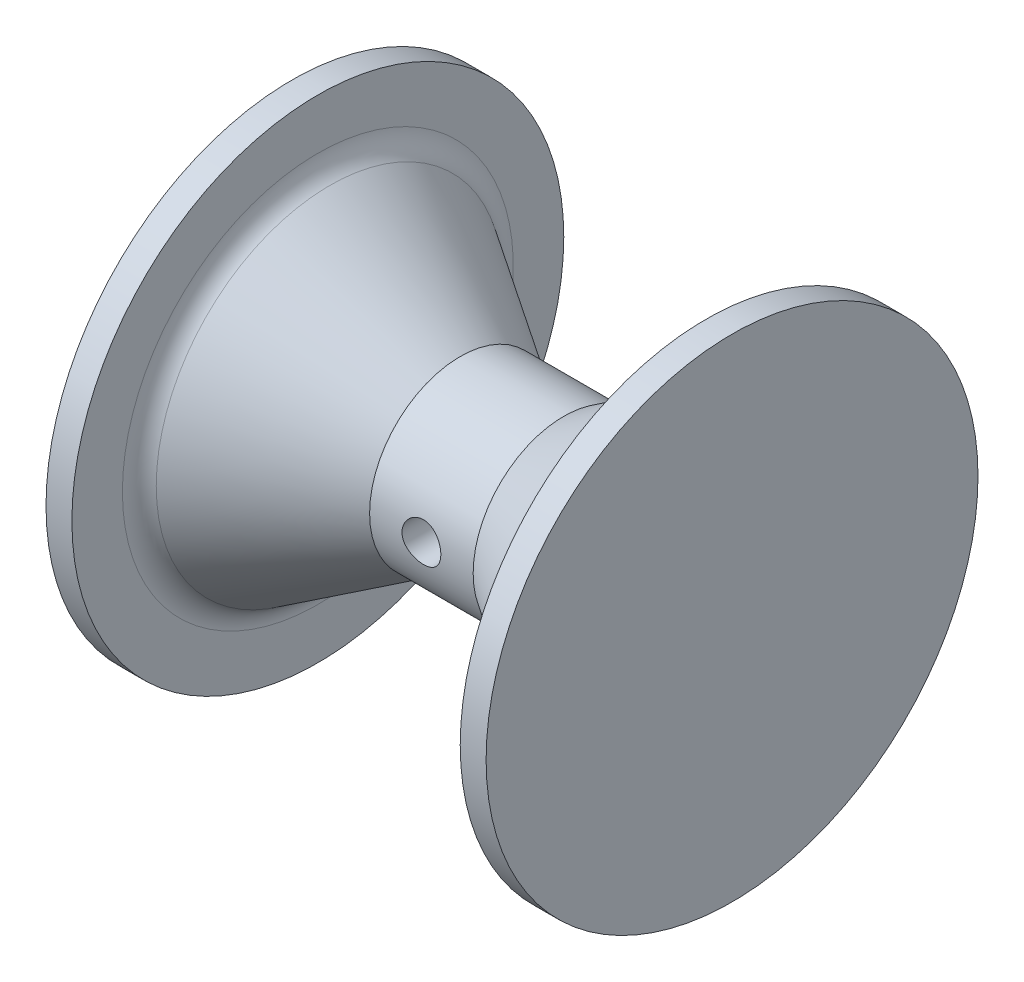
ISO-10303-21;
HEADER;
FILE_DESCRIPTION(('STEP AP214'),'2;1');
FILE_NAME('part.step','',(''),(''),'','','');
FILE_SCHEMA(('AUTOMOTIVE_DESIGN { 1 0 10303 214 1 1 1 1 }'));
ENDSEC;
DATA;
#1=APPLICATION_CONTEXT('core data for automotive mechanical design processes');
#2=APPLICATION_PROTOCOL_DEFINITION('international standard','automotive_design',2000,#1);
#3=PRODUCT_CONTEXT('',#1,'mechanical');
#4=PRODUCT('Part','Part','',(#3));
#5=PRODUCT_RELATED_PRODUCT_CATEGORY('part','',(#4));
#6=PRODUCT_DEFINITION_FORMATION('','',#4);
#7=PRODUCT_DEFINITION_CONTEXT('part definition',#1,'design');
#8=PRODUCT_DEFINITION('design','',#6,#7);
#9=PRODUCT_DEFINITION_SHAPE('','',#8);
#10=(LENGTH_UNIT() NAMED_UNIT(*) SI_UNIT(.MILLI.,.METRE.));
#11=(NAMED_UNIT(*) PLANE_ANGLE_UNIT() SI_UNIT($,.RADIAN.));
#12=(NAMED_UNIT(*) SI_UNIT($,.STERADIAN.) SOLID_ANGLE_UNIT());
#13=UNCERTAINTY_MEASURE_WITH_UNIT(LENGTH_MEASURE(1.E-05),#10,'distance_accuracy_value','');
#14=(GEOMETRIC_REPRESENTATION_CONTEXT(3) GLOBAL_UNCERTAINTY_ASSIGNED_CONTEXT((#13)) GLOBAL_UNIT_ASSIGNED_CONTEXT((#10,
#11,#12)) REPRESENTATION_CONTEXT('',''));
#15=CARTESIAN_POINT('',(0.,0.,0.));
#16=DIRECTION('',(0.,0.,1.));
#17=DIRECTION('',(1.,0.,0.));
#18=AXIS2_PLACEMENT_3D('',#15,#16,#17);
#19=CARTESIAN_POINT('',(-4.,0.,0.));
#20=DIRECTION('',(-1.,0.,0.));
#21=DIRECTION('',(0.,0.,1.));
#22=AXIS2_PLACEMENT_3D('',#19,#20,#21);
#23=CONICAL_SURFACE('',#22,7.,0.566729217523506);
#24=CARTESIAN_POINT('',(-14.0737509843863,0.,0.));
#25=DIRECTION('',(-1.,0.,0.));
#26=DIRECTION('',(0.,0.,1.));
#27=AXIS2_PLACEMENT_3D('',#24,#25,#26);
#28=CIRCLE('',#27,13.4105688082458);
#29=CARTESIAN_POINT('',(-14.0737509843863,0.,13.4105688082458));
#30=VERTEX_POINT('',#29);
#31=EDGE_CURVE('E194',#30,#30,#28,.F.);
#32=ORIENTED_EDGE('',*,*,#31,.T.);
#33=EDGE_LOOP('',(#32));
#34=FACE_BOUND('',#33,.T.);
#35=CARTESIAN_POINT('',(-4.,0.,0.));
#36=DIRECTION('',(-1.,0.,0.));
#37=DIRECTION('',(0.,0.,1.));
#38=AXIS2_PLACEMENT_3D('',#35,#36,#37);
#39=CIRCLE('',#38,7.);
#40=CARTESIAN_POINT('',(-4.,0.,7.));
#41=VERTEX_POINT('',#40);
#42=EDGE_CURVE('E115',#41,#41,#39,.T.);
#43=ORIENTED_EDGE('',*,*,#42,.T.);
#44=EDGE_LOOP('',(#43));
#45=FACE_BOUND('',#44,.T.);
#46=ADVANCED_FACE('F39',(#34,#45),#23,.T.);
#47=CARTESIAN_POINT('',(0.,0.,0.));
#48=DIRECTION('',(-1.,0.,0.));
#49=DIRECTION('',(0.,0.,1.));
#50=AXIS2_PLACEMENT_3D('',#47,#48,#49);
#51=CYLINDRICAL_SURFACE('',#50,7.);
#52=CARTESIAN_POINT('',(1.5,0.,7.));
#53=CARTESIAN_POINT('',(1.4999971004257,-0.0832358860906166,6.99999846043226));
#54=CARTESIAN_POINT('',(1.49304839161214,-0.166507195600275,6.9985002594971));
#55=CARTESIAN_POINT('',(1.46546434314641,-0.330687344293327,6.99266829827728));
#56=CARTESIAN_POINT('',(1.44481895580507,-0.41159440357119,6.98833245637099));
#57=CARTESIAN_POINT('',(1.39051563539196,-0.568649323817736,6.97730831788826));
#58=CARTESIAN_POINT('',(1.35687102061868,-0.644801963446555,6.97062242967171));
#59=CARTESIAN_POINT('',(1.27756591382874,-0.790378177960787,6.9556210681797));
#60=CARTESIAN_POINT('',(1.23190583075006,-0.859801981747369,6.94730565036661));
#61=CARTESIAN_POINT('',(1.12911970032649,-0.991024790535229,6.92981369246311));
#62=CARTESIAN_POINT('',(1.07184377810147,-1.05270503419445,6.92062683143259));
#63=CARTESIAN_POINT('',(0.947773684314803,-1.16566042389435,6.90250069814144));
#64=CARTESIAN_POINT('',(0.880978691748742,-1.21693467150908,6.8935614473163));
#65=CARTESIAN_POINT('',(0.738894247139567,-1.30814204379809,6.87684116047225));
#66=CARTESIAN_POINT('',(0.66352248224379,-1.34794958335009,6.8690733634436));
#67=CARTESIAN_POINT('',(0.506965546233162,-1.41428823691148,6.85572325558537));
#68=CARTESIAN_POINT('',(0.425781041507426,-1.44082087001716,6.85014069470711));
#69=CARTESIAN_POINT('',(0.261188913411926,-1.47946574422454,6.84189808926311));
#70=CARTESIAN_POINT('',(0.177832724336135,-1.49178779748342,6.83919556896486));
#71=CARTESIAN_POINT('',(0.0101957674930052,-1.50231395206577,6.83689139845106));
#72=CARTESIAN_POINT('',(-0.0740848901799469,-1.50051971664629,6.83728938291729));
#73=CARTESIAN_POINT('',(-0.239624687933792,-1.48303326340861,6.84110276603832));
#74=CARTESIAN_POINT('',(-0.320910889100153,-1.46758398649408,6.84446541682162));
#75=CARTESIAN_POINT('',(-0.479710240289342,-1.42361054298677,6.85374593375788));
#76=CARTESIAN_POINT('',(-0.557223186032321,-1.39508566936466,6.85966393808402));
#77=CARTESIAN_POINT('',(-0.706962872873339,-1.32554551075991,6.87344080755724));
#78=CARTESIAN_POINT('',(-0.779144512712551,-1.2844361097283,6.88131420983365));
#79=CARTESIAN_POINT('',(-0.915675164957957,-1.19096007283993,6.89810572501288));
#80=CARTESIAN_POINT('',(-0.980023148686202,-1.13859196103562,6.90702397481896));
#81=CARTESIAN_POINT('',(-1.1004593556734,-1.0227954275532,6.92512718393878));
#82=CARTESIAN_POINT('',(-1.15634870658474,-0.95916023396441,6.93431383972178));
#83=CARTESIAN_POINT('',(-1.25669373368966,-0.823317306269096,6.95175017497059));
#84=CARTESIAN_POINT('',(-1.30114921860039,-0.7511094287754,6.95999983875972));
#85=CARTESIAN_POINT('',(-1.37741067990693,-0.59993346204996,6.97465778534003));
#86=CARTESIAN_POINT('',(-1.40919141257798,-0.520952258863483,6.98106238643354));
#87=CARTESIAN_POINT('',(-1.45897564832109,-0.358603146685707,6.99128109245334));
#88=CARTESIAN_POINT('',(-1.47698107256332,-0.275235851133669,6.99509555860384));
#89=CARTESIAN_POINT('',(-1.49841621414342,-0.108187670836629,6.99965306347808));
#90=CARTESIAN_POINT('',(-1.50211771288178,-0.0245431772716144,7.00045336521066));
#91=CARTESIAN_POINT('',(-1.49557542887484,0.142168973650405,6.99905248935969));
#92=CARTESIAN_POINT('',(-1.48533255203706,0.225236668127255,6.99685150675698));
#93=CARTESIAN_POINT('',(-1.4514177563383,0.387542537982806,6.98973143045266));
#94=CARTESIAN_POINT('',(-1.42788763052747,0.466811712908478,6.9848410504546));
#95=CARTESIAN_POINT('',(-1.36822305700518,0.620278450473418,6.9728892442151));
#96=CARTESIAN_POINT('',(-1.33208756568835,0.69447559258774,6.96582763822237));
#97=CARTESIAN_POINT('',(-1.24766645693967,0.836821397964754,6.950175043904));
#98=CARTESIAN_POINT('',(-1.19922020509027,0.90487257511114,6.94156431354275));
#99=CARTESIAN_POINT('',(-1.09176517511126,1.0319769255236,6.92381033034847));
#100=CARTESIAN_POINT('',(-1.03275508411256,1.091028978692,6.91466701142097));
#101=CARTESIAN_POINT('',(-0.904602629812864,1.19952711057989,6.89668172706324));
#102=CARTESIAN_POINT('',(-0.835299900777897,1.24878537255157,6.88784792221285));
#103=CARTESIAN_POINT('',(-0.689245403522007,1.3349641538604,6.87166654559681));
#104=CARTESIAN_POINT('',(-0.612493953022508,1.37188519913706,6.86431891048055));
#105=CARTESIAN_POINT('',(-0.454127701005397,1.43209741248548,6.8520100980739));
#106=CARTESIAN_POINT('',(-0.372542643569332,1.45546398641275,6.84703574582967));
#107=CARTESIAN_POINT('',(-0.206484416166364,1.48812696085335,6.84001186708418));
#108=CARTESIAN_POINT('',(-0.12201168879868,1.49742550780258,6.83796189439706));
#109=CARTESIAN_POINT('',(0.045532343175243,1.5015999992604,6.83704618848155));
#110=CARTESIAN_POINT('',(0.128596014980579,1.49677347258311,6.83811476518543));
#111=CARTESIAN_POINT('',(0.292697242132587,1.47349789406331,6.8431676318483));
#112=CARTESIAN_POINT('',(0.373734819386573,1.45504898957979,6.84715189026714));
#113=CARTESIAN_POINT('',(0.531258657869168,1.40519345940434,6.85755581104157));
#114=CARTESIAN_POINT('',(0.607758648664291,1.37382847170887,6.86396764224703));
#115=CARTESIAN_POINT('',(0.754455372506849,1.29906751595601,6.87850764590649));
#116=CARTESIAN_POINT('',(0.824651478615044,1.255670353015,6.88663598880363));
#117=CARTESIAN_POINT('',(0.958218193725366,1.15708290349304,6.90389055593232));
#118=CARTESIAN_POINT('',(1.02142969594698,1.10167987421237,6.91303309938926));
#119=CARTESIAN_POINT('',(1.13775626252046,0.98108655461962,6.93117449799694));
#120=CARTESIAN_POINT('',(1.1908689943122,0.915894009385597,6.94017331951296));
#121=CARTESIAN_POINT('',(1.28611595950556,0.776603147268717,6.95714491048987));
#122=CARTESIAN_POINT('',(1.32810660623098,0.702404846009642,6.96510364570626));
#123=CARTESIAN_POINT('',(1.39895452890618,0.547850160940598,6.97895826104019));
#124=CARTESIAN_POINT('',(1.42782302258504,0.46749910586388,6.98485590212343));
#125=CARTESIAN_POINT('',(1.46635218513115,0.322535217553203,6.99284848461772));
#126=CARTESIAN_POINT('',(1.47894643398003,0.258717205545978,6.99551391888263));
#127=CARTESIAN_POINT('',(1.49577130171167,0.129939960853846,6.99909024154719));
#128=CARTESIAN_POINT('',(1.50000226364606,0.0649807750887447,7.00000120191314));
#129=CARTESIAN_POINT('',(1.5,0.,7.));
#130=B_SPLINE_CURVE_WITH_KNOTS('',3,(#52,#53,#54,#55,#56,#57,#58,#59,#60,#61,#62,#63,#64,#65,
#66,#67,#68,#69,#70,#71,#72,#73,#74,#75,#76,#77,#78,#79,#80,#81,#82,#83,#84,#85,#86,#87,#88,#89,
#90,#91,#92,#93,#94,#95,#96,#97,#98,#99,#100,#101,#102,#103,#104,#105,#106,#107,#108,#109,#110,
#111,#112,#113,#114,#115,#116,#117,#118,#119,#120,#121,#122,#123,#124,#125,#126,#127,#128,#129),
.UNSPECIFIED.,.T.,.F.,(4,2,2,2,2,2,2,2,2,2,2,2,2,2,2,2,2,2,2,2,2,2,2,2,2,2,2,2,2,2,2,2,2,2,2,2,
2,2,4),(0.,0.249469836512082,0.499122883219936,0.748520824425602,0.997910278645886,
1.25074961881732,1.50361077918506,1.7591442921451,2.0146485567749,2.26633008124666,
2.51798195169165,2.76524475452928,3.01252092904568,3.26169356165968,3.51089887920889,
3.76527011050291,4.0196455970235,4.27452521139806,4.52936927256343,4.77934665704185,
5.02930780231429,5.27665060589267,5.52401389198434,5.77478733867803,6.02559197304485,
6.28082063283534,6.53603841075806,6.78982240408475,7.04356767229185,7.29200680540294,
7.5404432510827,7.78808499706785,8.03575134451623,8.28822950154114,8.54076590397115,
8.79641910357222,9.05185334010271,9.24661799132294,9.44137465337336),.UNSPECIFIED.);
#131=CARTESIAN_POINT('',(1.5,0.,7.));
#132=VERTEX_POINT('',#131);
#133=EDGE_CURVE('E84',#132,#132,#130,.T.);
#134=ORIENTED_EDGE('',*,*,#133,.T.);
#135=EDGE_LOOP('',(#134));
#136=FACE_BOUND('',#135,.T.);
#137=CARTESIAN_POINT('',(1.5,0.,-7.));
#138=CARTESIAN_POINT('',(1.4999971004257,0.0832358860906166,-6.99999846043226));
#139=CARTESIAN_POINT('',(1.49304839161214,0.166507195600275,-6.9985002594971));
#140=CARTESIAN_POINT('',(1.46546434314641,0.330687344293327,-6.99266829827728));
#141=CARTESIAN_POINT('',(1.44481895580507,0.41159440357119,-6.98833245637099));
#142=CARTESIAN_POINT('',(1.39051563539196,0.568649323817736,-6.97730831788826));
#143=CARTESIAN_POINT('',(1.35687102061868,0.644801963446555,-6.97062242967171));
#144=CARTESIAN_POINT('',(1.27756591382874,0.790378177960787,-6.9556210681797));
#145=CARTESIAN_POINT('',(1.23190583075006,0.859801981747369,-6.94730565036661));
#146=CARTESIAN_POINT('',(1.12911970032649,0.991024790535229,-6.92981369246311));
#147=CARTESIAN_POINT('',(1.07184377810147,1.05270503419445,-6.92062683143259));
#148=CARTESIAN_POINT('',(0.947773684314803,1.16566042389435,-6.90250069814144));
#149=CARTESIAN_POINT('',(0.880978691748742,1.21693467150908,-6.8935614473163));
#150=CARTESIAN_POINT('',(0.738894247139567,1.30814204379809,-6.87684116047225));
#151=CARTESIAN_POINT('',(0.66352248224379,1.34794958335009,-6.8690733634436));
#152=CARTESIAN_POINT('',(0.506965546233162,1.41428823691148,-6.85572325558537));
#153=CARTESIAN_POINT('',(0.425781041507426,1.44082087001716,-6.85014069470711));
#154=CARTESIAN_POINT('',(0.261188913411926,1.47946574422454,-6.84189808926311));
#155=CARTESIAN_POINT('',(0.177832724336135,1.49178779748342,-6.83919556896486));
#156=CARTESIAN_POINT('',(0.0101957674930052,1.50231395206577,-6.83689139845106));
#157=CARTESIAN_POINT('',(-0.0740848901799469,1.50051971664629,-6.83728938291729));
#158=CARTESIAN_POINT('',(-0.239624687933792,1.48303326340861,-6.84110276603832));
#159=CARTESIAN_POINT('',(-0.320910889100153,1.46758398649408,-6.84446541682162));
#160=CARTESIAN_POINT('',(-0.479710240289342,1.42361054298677,-6.85374593375788));
#161=CARTESIAN_POINT('',(-0.557223186032321,1.39508566936466,-6.85966393808402));
#162=CARTESIAN_POINT('',(-0.706962872873339,1.32554551075991,-6.87344080755724));
#163=CARTESIAN_POINT('',(-0.779144512712551,1.2844361097283,-6.88131420983365));
#164=CARTESIAN_POINT('',(-0.915675164957957,1.19096007283993,-6.89810572501288));
#165=CARTESIAN_POINT('',(-0.980023148686202,1.13859196103562,-6.90702397481896));
#166=CARTESIAN_POINT('',(-1.1004593556734,1.0227954275532,-6.92512718393878));
#167=CARTESIAN_POINT('',(-1.15634870658474,0.95916023396441,-6.93431383972178));
#168=CARTESIAN_POINT('',(-1.25669373368966,0.823317306269096,-6.95175017497059));
#169=CARTESIAN_POINT('',(-1.30114921860039,0.7511094287754,-6.95999983875972));
#170=CARTESIAN_POINT('',(-1.37741067990693,0.59993346204996,-6.97465778534003));
#171=CARTESIAN_POINT('',(-1.40919141257798,0.520952258863483,-6.98106238643354));
#172=CARTESIAN_POINT('',(-1.45897564832109,0.358603146685707,-6.99128109245334));
#173=CARTESIAN_POINT('',(-1.47698107256332,0.275235851133669,-6.99509555860384));
#174=CARTESIAN_POINT('',(-1.49841621414342,0.108187670836629,-6.99965306347808));
#175=CARTESIAN_POINT('',(-1.50211771288178,0.0245431772716144,-7.00045336521066));
#176=CARTESIAN_POINT('',(-1.49557542887484,-0.142168973650405,-6.99905248935969));
#177=CARTESIAN_POINT('',(-1.48533255203706,-0.225236668127255,-6.99685150675698));
#178=CARTESIAN_POINT('',(-1.4514177563383,-0.387542537982806,-6.98973143045266));
#179=CARTESIAN_POINT('',(-1.42788763052747,-0.466811712908478,-6.9848410504546));
#180=CARTESIAN_POINT('',(-1.36822305700518,-0.620278450473418,-6.9728892442151));
#181=CARTESIAN_POINT('',(-1.33208756568835,-0.69447559258774,-6.96582763822237));
#182=CARTESIAN_POINT('',(-1.24766645693967,-0.836821397964754,-6.950175043904));
#183=CARTESIAN_POINT('',(-1.19922020509027,-0.90487257511114,-6.94156431354275));
#184=CARTESIAN_POINT('',(-1.09176517511126,-1.0319769255236,-6.92381033034847));
#185=CARTESIAN_POINT('',(-1.03275508411256,-1.091028978692,-6.91466701142097));
#186=CARTESIAN_POINT('',(-0.904602629812864,-1.19952711057989,-6.89668172706324));
#187=CARTESIAN_POINT('',(-0.835299900777897,-1.24878537255157,-6.88784792221285));
#188=CARTESIAN_POINT('',(-0.689245403522007,-1.3349641538604,-6.87166654559681));
#189=CARTESIAN_POINT('',(-0.612493953022508,-1.37188519913706,-6.86431891048055));
#190=CARTESIAN_POINT('',(-0.454127701005397,-1.43209741248548,-6.8520100980739));
#191=CARTESIAN_POINT('',(-0.372542643569332,-1.45546398641275,-6.84703574582967));
#192=CARTESIAN_POINT('',(-0.206484416166364,-1.48812696085335,-6.84001186708418));
#193=CARTESIAN_POINT('',(-0.12201168879868,-1.49742550780258,-6.83796189439706));
#194=CARTESIAN_POINT('',(0.045532343175243,-1.5015999992604,-6.83704618848155));
#195=CARTESIAN_POINT('',(0.128596014980579,-1.49677347258311,-6.83811476518543));
#196=CARTESIAN_POINT('',(0.292697242132587,-1.47349789406331,-6.8431676318483));
#197=CARTESIAN_POINT('',(0.373734819386573,-1.45504898957979,-6.84715189026714));
#198=CARTESIAN_POINT('',(0.531258657869168,-1.40519345940434,-6.85755581104157));
#199=CARTESIAN_POINT('',(0.607758648664291,-1.37382847170887,-6.86396764224703));
#200=CARTESIAN_POINT('',(0.754455372506849,-1.29906751595601,-6.87850764590649));
#201=CARTESIAN_POINT('',(0.824651478615044,-1.255670353015,-6.88663598880363));
#202=CARTESIAN_POINT('',(0.958218193725366,-1.15708290349304,-6.90389055593232));
#203=CARTESIAN_POINT('',(1.02142969594698,-1.10167987421237,-6.91303309938926));
#204=CARTESIAN_POINT('',(1.13775626252046,-0.98108655461962,-6.93117449799694));
#205=CARTESIAN_POINT('',(1.1908689943122,-0.915894009385597,-6.94017331951296));
#206=CARTESIAN_POINT('',(1.28611595950556,-0.776603147268717,-6.95714491048987));
#207=CARTESIAN_POINT('',(1.32810660623098,-0.702404846009642,-6.96510364570626));
#208=CARTESIAN_POINT('',(1.39895452890618,-0.547850160940598,-6.97895826104019));
#209=CARTESIAN_POINT('',(1.42782302258504,-0.46749910586388,-6.98485590212343));
#210=CARTESIAN_POINT('',(1.46635218513115,-0.322535217553203,-6.99284848461772));
#211=CARTESIAN_POINT('',(1.47894643398003,-0.258717205545978,-6.99551391888263));
#212=CARTESIAN_POINT('',(1.49577130171167,-0.129939960853846,-6.99909024154719));
#213=CARTESIAN_POINT('',(1.50000226364606,-0.0649807750887447,-7.00000120191314));
#214=CARTESIAN_POINT('',(1.5,0.,-7.));
#215=B_SPLINE_CURVE_WITH_KNOTS('',3,(#137,#138,#139,#140,#141,#142,#143,#144,#145,#146,#147,
#148,#149,#150,#151,#152,#153,#154,#155,#156,#157,#158,#159,#160,#161,#162,#163,#164,#165,#166,
#167,#168,#169,#170,#171,#172,#173,#174,#175,#176,#177,#178,#179,#180,#181,#182,#183,#184,#185,
#186,#187,#188,#189,#190,#191,#192,#193,#194,#195,#196,#197,#198,#199,#200,#201,#202,#203,#204,
#205,#206,#207,#208,#209,#210,#211,#212,#213,#214),.UNSPECIFIED.,.T.,.F.,(4,2,2,2,2,2,2,2,2,2,2,
2,2,2,2,2,2,2,2,2,2,2,2,2,2,2,2,2,2,2,2,2,2,2,2,2,2,2,4),(0.,0.249469836512082,
0.499122883219936,0.748520824425602,0.997910278645886,1.25074961881732,1.50361077918506,
1.7591442921451,2.0146485567749,2.26633008124666,2.51798195169165,2.76524475452928,
3.01252092904568,3.26169356165968,3.51089887920889,3.76527011050291,4.0196455970235,
4.27452521139806,4.52936927256343,4.77934665704185,5.02930780231429,5.27665060589267,
5.52401389198434,5.77478733867803,6.02559197304485,6.28082063283534,6.53603841075806,
6.78982240408475,7.04356767229185,7.29200680540294,7.5404432510827,7.78808499706785,
8.03575134451623,8.28822950154114,8.54076590397115,8.79641910357222,9.05185334010271,
9.24661799132294,9.44137465337336),.UNSPECIFIED.);
#216=CARTESIAN_POINT('',(1.5,0.,-7.));
#217=VERTEX_POINT('',#216);
#218=EDGE_CURVE('E88',#217,#217,#215,.T.);
#219=ORIENTED_EDGE('',*,*,#218,.T.);
#220=EDGE_LOOP('',(#219));
#221=FACE_BOUND('',#220,.T.);
#222=ORIENTED_EDGE('',*,*,#42,.F.);
#223=EDGE_LOOP('',(#222));
#224=FACE_BOUND('',#223,.T.);
#225=CARTESIAN_POINT('',(4.,0.,0.));
#226=DIRECTION('',(-1.,0.,0.));
#227=DIRECTION('',(0.,0.,1.));
#228=AXIS2_PLACEMENT_3D('',#225,#226,#227);
#229=CIRCLE('',#228,7.);
#230=CARTESIAN_POINT('',(4.,0.,7.));
#231=VERTEX_POINT('',#230);
#232=EDGE_CURVE('E111',#231,#231,#229,.T.);
#233=ORIENTED_EDGE('',*,*,#232,.T.);
#234=EDGE_LOOP('',(#233));
#235=FACE_BOUND('',#234,.T.);
#236=ADVANCED_FACE('F131',(#136,#221,#224,#235),#51,.T.);
#237=CARTESIAN_POINT('',(15.,0.,0.));
#238=DIRECTION('',(1.,0.,0.));
#239=DIRECTION('',(0.,0.,-1.));
#240=AXIS2_PLACEMENT_3D('',#237,#238,#239);
#241=CONICAL_SURFACE('',#240,14.,0.566729217523506);
#242=CARTESIAN_POINT('',(14.0737509843863,0.,0.));
#243=DIRECTION('',(1.,0.,0.));
#244=DIRECTION('',(0.,0.,-1.));
#245=AXIS2_PLACEMENT_3D('',#242,#243,#244);
#246=CIRCLE('',#245,13.4105688082458);
#247=CARTESIAN_POINT('',(14.0737509843863,0.,-13.4105688082458));
#248=VERTEX_POINT('',#247);
#249=EDGE_CURVE('E48',#248,#248,#246,.F.);
#250=ORIENTED_EDGE('',*,*,#249,.T.);
#251=EDGE_LOOP('',(#250));
#252=FACE_BOUND('',#251,.T.);
#253=ORIENTED_EDGE('',*,*,#232,.F.);
#254=EDGE_LOOP('',(#253));
#255=FACE_BOUND('',#254,.T.);
#256=ADVANCED_FACE('F170',(#252,#255),#241,.T.);
#257=CARTESIAN_POINT('',(15.,14.,0.));
#258=DIRECTION('',(1.,0.,0.));
#259=DIRECTION('',(0.,0.,-1.));
#260=AXIS2_PLACEMENT_3D('',#257,#258,#259);
#261=PLANE('',#260);
#262=CARTESIAN_POINT('',(15.,0.,0.));
#263=DIRECTION('',(1.,0.,0.));
#264=DIRECTION('',(0.,0.,-1.));
#265=AXIS2_PLACEMENT_3D('',#262,#263,#264);
#266=CIRCLE('',#265,15.0978917837101);
#267=CARTESIAN_POINT('',(15.,0.,-15.0978917837101));
#268=VERTEX_POINT('',#267);
#269=EDGE_CURVE('E11',#268,#268,#266,.T.);
#270=ORIENTED_EDGE('',*,*,#269,.T.);
#271=EDGE_LOOP('',(#270));
#272=FACE_BOUND('',#271,.T.);
#273=CARTESIAN_POINT('',(15.,0.,0.));
#274=DIRECTION('',(-1.,0.,0.));
#275=DIRECTION('',(0.,0.,1.));
#276=AXIS2_PLACEMENT_3D('',#273,#274,#275);
#277=CIRCLE('',#276,19.);
#278=CARTESIAN_POINT('',(15.,0.,19.));
#279=VERTEX_POINT('',#278);
#280=EDGE_CURVE('E107',#279,#279,#277,.T.);
#281=ORIENTED_EDGE('',*,*,#280,.T.);
#282=EDGE_LOOP('',(#281));
#283=FACE_BOUND('',#282,.T.);
#284=ADVANCED_FACE('F167',(#272,#283),#261,.F.);
#285=CARTESIAN_POINT('',(0.,0.,0.));
#286=DIRECTION('',(-1.,0.,0.));
#287=DIRECTION('',(0.,0.,1.));
#288=AXIS2_PLACEMENT_3D('',#285,#286,#287);
#289=CYLINDRICAL_SURFACE('',#288,19.);
#290=ORIENTED_EDGE('',*,*,#280,.F.);
#291=EDGE_LOOP('',(#290));
#292=FACE_BOUND('',#291,.T.);
#293=CARTESIAN_POINT('',(17.,0.,0.));
#294=DIRECTION('',(-1.,0.,0.));
#295=DIRECTION('',(0.,0.,1.));
#296=AXIS2_PLACEMENT_3D('',#293,#294,#295);
#297=CIRCLE('',#296,19.);
#298=CARTESIAN_POINT('',(17.,0.,19.));
#299=VERTEX_POINT('',#298);
#300=EDGE_CURVE('E103',#299,#299,#297,.T.);
#301=ORIENTED_EDGE('',*,*,#300,.T.);
#302=EDGE_LOOP('',(#301));
#303=FACE_BOUND('',#302,.T.);
#304=ADVANCED_FACE('F163',(#292,#303),#289,.T.);
#305=CARTESIAN_POINT('',(17.,19.,0.));
#306=DIRECTION('',(-1.,0.,0.));
#307=DIRECTION('',(0.,0.,1.));
#308=AXIS2_PLACEMENT_3D('',#305,#306,#307);
#309=PLANE('',#308);
#310=ORIENTED_EDGE('',*,*,#300,.F.);
#311=EDGE_LOOP('',(#310));
#312=FACE_BOUND('',#311,.T.);
#313=ADVANCED_FACE('F160',(#312),#309,.F.);
#314=CARTESIAN_POINT('',(-17.,19.,0.));
#315=DIRECTION('',(1.,0.,0.));
#316=DIRECTION('',(0.,0.,-1.));
#317=AXIS2_PLACEMENT_3D('',#314,#315,#316);
#318=PLANE('',#317);
#319=DIRECTION('',(0.,1.,0.));
#320=VECTOR('',#319,1.);
#321=CARTESIAN_POINT('',(-17.,1.57480157480236,2.9));
#322=LINE('',#321,#320);
#323=CARTESIAN_POINT('',(-17.,-1.57480157480236,2.9));
#324=VERTEX_POINT('',#323);
#325=CARTESIAN_POINT('',(-17.,1.57480157480236,2.9));
#326=VERTEX_POINT('',#325);
#327=EDGE_CURVE('E76',#324,#326,#322,.T.);
#328=ORIENTED_EDGE('',*,*,#327,.F.);
#329=CARTESIAN_POINT('',(-17.,0.,0.));
#330=DIRECTION('',(-1.,0.,0.));
#331=DIRECTION('',(0.,0.,1.));
#332=AXIS2_PLACEMENT_3D('',#329,#330,#331);
#333=CIRCLE('',#332,3.3);
#334=EDGE_CURVE('E55',#326,#324,#333,.T.);
#335=ORIENTED_EDGE('',*,*,#334,.F.);
#336=EDGE_LOOP('',(#328,#335));
#337=FACE_BOUND('',#336,.T.);
#338=CARTESIAN_POINT('',(-17.,0.,0.));
#339=DIRECTION('',(-1.,0.,0.));
#340=DIRECTION('',(0.,0.,1.));
#341=AXIS2_PLACEMENT_3D('',#338,#339,#340);
#342=CIRCLE('',#341,19.);
#343=CARTESIAN_POINT('',(-17.,0.,19.));
#344=VERTEX_POINT('',#343);
#345=EDGE_CURVE('E99',#344,#344,#342,.T.);
#346=ORIENTED_EDGE('',*,*,#345,.T.);
#347=EDGE_LOOP('',(#346));
#348=FACE_BOUND('',#347,.T.);
#349=ADVANCED_FACE('F81',(#337,#348),#318,.F.);
#350=CARTESIAN_POINT('',(0.,0.,0.));
#351=DIRECTION('',(-1.,0.,0.));
#352=DIRECTION('',(0.,0.,1.));
#353=AXIS2_PLACEMENT_3D('',#350,#351,#352);
#354=CYLINDRICAL_SURFACE('',#353,19.);
#355=ORIENTED_EDGE('',*,*,#345,.F.);
#356=EDGE_LOOP('',(#355));
#357=FACE_BOUND('',#356,.T.);
#358=CARTESIAN_POINT('',(-15.,0.,0.));
#359=DIRECTION('',(-1.,0.,0.));
#360=DIRECTION('',(0.,0.,1.));
#361=AXIS2_PLACEMENT_3D('',#358,#359,#360);
#362=CIRCLE('',#361,19.);
#363=CARTESIAN_POINT('',(-15.,0.,19.));
#364=VERTEX_POINT('',#363);
#365=EDGE_CURVE('E72',#364,#364,#362,.T.);
#366=ORIENTED_EDGE('',*,*,#365,.T.);
#367=EDGE_LOOP('',(#366));
#368=FACE_BOUND('',#367,.T.);
#369=ADVANCED_FACE('F153',(#357,#368),#354,.T.);
#370=CARTESIAN_POINT('',(-15.,14.,0.));
#371=DIRECTION('',(-1.,0.,0.));
#372=DIRECTION('',(0.,0.,1.));
#373=AXIS2_PLACEMENT_3D('',#370,#371,#372);
#374=PLANE('',#373);
#375=CARTESIAN_POINT('',(-15.,0.,0.));
#376=DIRECTION('',(-1.,0.,0.));
#377=DIRECTION('',(0.,0.,1.));
#378=AXIS2_PLACEMENT_3D('',#375,#376,#377);
#379=CIRCLE('',#378,15.0978917837101);
#380=CARTESIAN_POINT('',(-15.,0.,15.0978917837101));
#381=VERTEX_POINT('',#380);
#382=EDGE_CURVE('E119',#381,#381,#379,.T.);
#383=ORIENTED_EDGE('',*,*,#382,.T.);
#384=EDGE_LOOP('',(#383));
#385=FACE_BOUND('',#384,.T.);
#386=ORIENTED_EDGE('',*,*,#365,.F.);
#387=EDGE_LOOP('',(#386));
#388=FACE_BOUND('',#387,.T.);
#389=ADVANCED_FACE('F150',(#385,#388),#374,.F.);
#390=CARTESIAN_POINT('',(-4.,0.,0.));
#391=DIRECTION('',(-1.,0.,0.));
#392=DIRECTION('',(0.,0.,1.));
#393=AXIS2_PLACEMENT_3D('',#390,#391,#392);
#394=CYLINDRICAL_SURFACE('',#393,3.3);
#395=ORIENTED_EDGE('',*,*,#334,.T.);
#396=DIRECTION('',(-1.,0.,0.));
#397=VECTOR('',#396,1.);
#398=CARTESIAN_POINT('',(-4.,-1.57480157480236,2.9));
#399=LINE('',#398,#397);
#400=CARTESIAN_POINT('',(-4.,-1.57480157480236,2.9));
#401=VERTEX_POINT('',#400);
#402=EDGE_CURVE('E73',#401,#324,#399,.T.);
#403=ORIENTED_EDGE('',*,*,#402,.F.);
#404=CARTESIAN_POINT('',(-4.,0.,0.));
#405=DIRECTION('',(-1.,0.,0.));
#406=DIRECTION('',(0.,0.,1.));
#407=AXIS2_PLACEMENT_3D('',#404,#405,#406);
#408=CIRCLE('',#407,3.3);
#409=CARTESIAN_POINT('',(-4.,1.57480157480236,2.9));
#410=VERTEX_POINT('',#409);
#411=EDGE_CURVE('E69',#410,#401,#408,.T.);
#412=ORIENTED_EDGE('',*,*,#411,.F.);
#413=DIRECTION('',(-1.,0.,0.));
#414=VECTOR('',#413,1.);
#415=CARTESIAN_POINT('',(-4.,1.57480157480236,2.9));
#416=LINE('',#415,#414);
#417=EDGE_CURVE('E63',#410,#326,#416,.T.);
#418=ORIENTED_EDGE('',*,*,#417,.T.);
#419=EDGE_LOOP('',(#395,#403,#412,#418));
#420=FACE_BOUND('',#419,.T.);
#421=ADVANCED_FACE('F67',(#420),#394,.F.);
#422=CARTESIAN_POINT('',(-4.,1.57480157480236,2.9));
#423=DIRECTION('',(0.,0.,1.));
#424=DIRECTION('',(1.,0.,0.));
#425=AXIS2_PLACEMENT_3D('',#422,#423,#424);
#426=PLANE('',#425);
#427=ORIENTED_EDGE('',*,*,#327,.T.);
#428=ORIENTED_EDGE('',*,*,#417,.F.);
#429=DIRECTION('',(0.,1.,0.));
#430=VECTOR('',#429,1.);
#431=CARTESIAN_POINT('',(-4.,1.57480157480236,2.9));
#432=LINE('',#431,#430);
#433=EDGE_CURVE('E91',#401,#410,#432,.T.);
#434=ORIENTED_EDGE('',*,*,#433,.F.);
#435=ORIENTED_EDGE('',*,*,#402,.T.);
#436=EDGE_LOOP('',(#427,#428,#434,#435));
#437=FACE_BOUND('',#436,.T.);
#438=ADVANCED_FACE('F77',(#437),#426,.F.);
#439=CARTESIAN_POINT('',(-4.,0.,0.));
#440=DIRECTION('',(-1.,0.,0.));
#441=DIRECTION('',(0.,0.,1.));
#442=AXIS2_PLACEMENT_3D('',#439,#440,#441);
#443=PLANE('',#442);
#444=ORIENTED_EDGE('',*,*,#411,.T.);
#445=ORIENTED_EDGE('',*,*,#433,.T.);
#446=EDGE_LOOP('',(#444,#445));
#447=FACE_BOUND('',#446,.T.);
#448=ADVANCED_FACE('F140',(#447),#443,.T.);
#449=CARTESIAN_POINT('',(0.,0.,-17.5));
#450=DIRECTION('',(0.,0.,1.));
#451=DIRECTION('',(1.,0.,0.));
#452=AXIS2_PLACEMENT_3D('',#449,#450,#451);
#453=CYLINDRICAL_SURFACE('',#452,1.5);
#454=ORIENTED_EDGE('',*,*,#218,.F.);
#455=EDGE_LOOP('',(#454));
#456=FACE_BOUND('',#455,.T.);
#457=ORIENTED_EDGE('',*,*,#133,.F.);
#458=EDGE_LOOP('',(#457));
#459=FACE_BOUND('',#458,.T.);
#460=ADVANCED_FACE('F135',(#456,#459),#453,.F.);
#461=CARTESIAN_POINT('',(-13.,0.,0.));
#462=DIRECTION('',(-1.,0.,0.));
#463=DIRECTION('',(0.,0.,1.));
#464=AXIS2_PLACEMENT_3D('',#461,#462,#463);
#465=TOROIDAL_SURFACE('',#464,15.0978917837101,2.);
#466=ORIENTED_EDGE('',*,*,#31,.F.);
#467=EDGE_LOOP('',(#466));
#468=FACE_BOUND('',#467,.T.);
#469=ORIENTED_EDGE('',*,*,#382,.F.);
#470=EDGE_LOOP('',(#469));
#471=FACE_BOUND('',#470,.T.);
#472=ADVANCED_FACE('F139',(#468,#471),#465,.F.);
#473=CARTESIAN_POINT('',(13.,0.,0.));
#474=DIRECTION('',(1.,0.,0.));
#475=DIRECTION('',(0.,0.,-1.));
#476=AXIS2_PLACEMENT_3D('',#473,#474,#475);
#477=TOROIDAL_SURFACE('',#476,15.0978917837101,2.);
#478=ORIENTED_EDGE('',*,*,#269,.F.);
#479=EDGE_LOOP('',(#478));
#480=FACE_BOUND('',#479,.T.);
#481=ORIENTED_EDGE('',*,*,#249,.F.);
#482=EDGE_LOOP('',(#481));
#483=FACE_BOUND('',#482,.T.);
#484=ADVANCED_FACE('F41',(#480,#483),#477,.F.);
#485=CLOSED_SHELL('',(#46,#236,#256,#284,#304,#313,#349,#369,#389,#421,#438,#448,#460,#472,#484));
#486=MANIFOLD_SOLID_BREP('B2',#485);
#487=ADVANCED_BREP_SHAPE_REPRESENTATION('',(#18,#486),#14);
#488=SHAPE_DEFINITION_REPRESENTATION(#9,#487);
ENDSEC;
END-ISO-10303-21;
